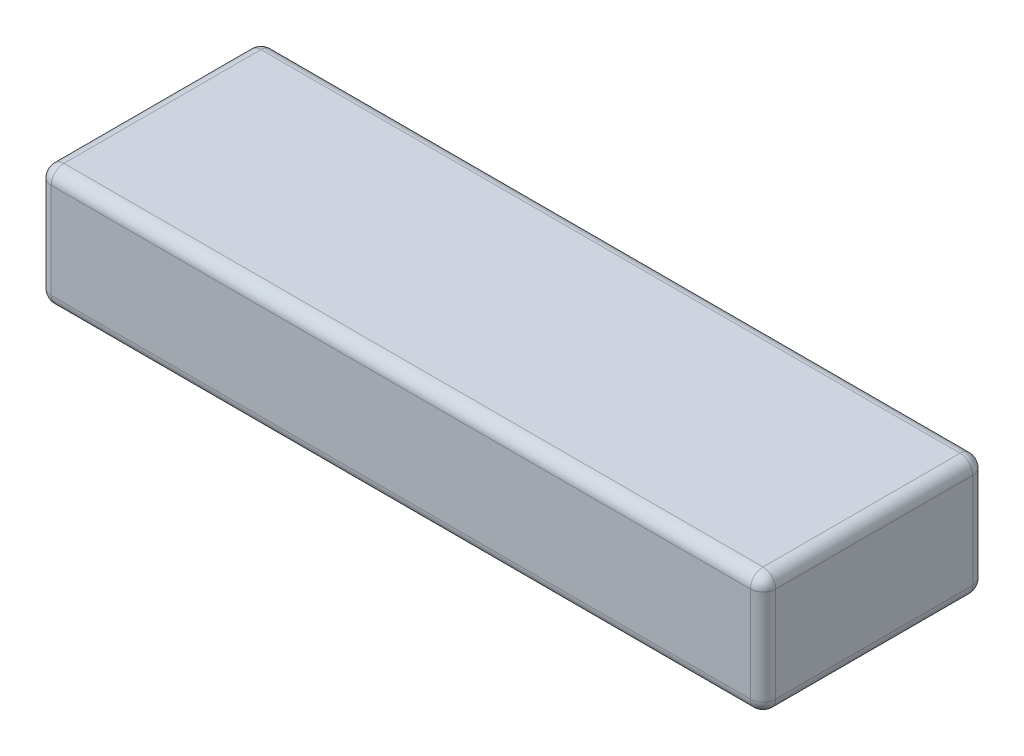
ISO-10303-21;
HEADER;
FILE_DESCRIPTION(('STEP AP214'),'2;1');
FILE_NAME('part.step','',(''),(''),'','','');
FILE_SCHEMA(('AUTOMOTIVE_DESIGN { 1 0 10303 214 1 1 1 1 }'));
ENDSEC;
DATA;
#1=APPLICATION_CONTEXT('core data for automotive mechanical design processes');
#2=APPLICATION_PROTOCOL_DEFINITION('international standard','automotive_design',2000,#1);
#3=PRODUCT_CONTEXT('',#1,'mechanical');
#4=PRODUCT('Part','Part','',(#3));
#5=PRODUCT_RELATED_PRODUCT_CATEGORY('part','',(#4));
#6=PRODUCT_DEFINITION_FORMATION('','',#4);
#7=PRODUCT_DEFINITION_CONTEXT('part definition',#1,'design');
#8=PRODUCT_DEFINITION('design','',#6,#7);
#9=PRODUCT_DEFINITION_SHAPE('','',#8);
#10=(LENGTH_UNIT() NAMED_UNIT(*) SI_UNIT(.MILLI.,.METRE.));
#11=(NAMED_UNIT(*) PLANE_ANGLE_UNIT() SI_UNIT($,.RADIAN.));
#12=(NAMED_UNIT(*) SI_UNIT($,.STERADIAN.) SOLID_ANGLE_UNIT());
#13=UNCERTAINTY_MEASURE_WITH_UNIT(LENGTH_MEASURE(1.E-05),#10,'distance_accuracy_value','');
#14=(GEOMETRIC_REPRESENTATION_CONTEXT(3) GLOBAL_UNCERTAINTY_ASSIGNED_CONTEXT((#13)) GLOBAL_UNIT_ASSIGNED_CONTEXT((#10,
#11,#12)) REPRESENTATION_CONTEXT('',''));
#15=CARTESIAN_POINT('',(0.,0.,0.));
#16=DIRECTION('',(0.,0.,1.));
#17=DIRECTION('',(1.,0.,0.));
#18=AXIS2_PLACEMENT_3D('',#15,#16,#17);
#19=CARTESIAN_POINT('',(0.,19.,0.));
#20=DIRECTION('',(1.,0.,0.));
#21=DIRECTION('',(0.,0.,-1.));
#22=AXIS2_PLACEMENT_3D('',#19,#20,#21);
#23=PLANE('',#22);
#24=DIRECTION('',(0.,0.,1.));
#25=VECTOR('',#24,1.);
#26=CARTESIAN_POINT('',(0.,2.,0.));
#27=LINE('',#26,#25);
#28=CARTESIAN_POINT('',(0.,2.,-33.));
#29=VERTEX_POINT('',#28);
#30=CARTESIAN_POINT('',(0.,2.,-2.));
#31=VERTEX_POINT('',#30);
#32=EDGE_CURVE('E241',#29,#31,#27,.T.);
#33=ORIENTED_EDGE('',*,*,#32,.T.);
#34=DIRECTION('',(0.,-1.,0.));
#35=VECTOR('',#34,1.);
#36=CARTESIAN_POINT('',(0.,19.,-2.));
#37=LINE('',#36,#35);
#38=CARTESIAN_POINT('',(0.,17.,-2.));
#39=VERTEX_POINT('',#38);
#40=EDGE_CURVE('E192',#31,#39,#37,.F.);
#41=ORIENTED_EDGE('',*,*,#40,.T.);
#42=DIRECTION('',(0.,0.,1.));
#43=VECTOR('',#42,1.);
#44=CARTESIAN_POINT('',(0.,17.,0.));
#45=LINE('',#44,#43);
#46=CARTESIAN_POINT('',(0.,17.,-33.));
#47=VERTEX_POINT('',#46);
#48=EDGE_CURVE('E238',#39,#47,#45,.F.);
#49=ORIENTED_EDGE('',*,*,#48,.T.);
#50=DIRECTION('',(0.,-1.,0.));
#51=VECTOR('',#50,1.);
#52=CARTESIAN_POINT('',(0.,19.,-33.));
#53=LINE('',#52,#51);
#54=EDGE_CURVE('E190',#47,#29,#53,.T.);
#55=ORIENTED_EDGE('',*,*,#54,.T.);
#56=EDGE_LOOP('',(#33,#41,#49,#55));
#57=FACE_BOUND('',#56,.T.);
#58=ADVANCED_FACE('F37',(#57),#23,.F.);
#59=CARTESIAN_POINT('',(0.,19.,0.));
#60=DIRECTION('',(0.,0.,-1.));
#61=DIRECTION('',(-1.,0.,0.));
#62=AXIS2_PLACEMENT_3D('',#59,#60,#61);
#63=PLANE('',#62);
#64=DIRECTION('',(1.,0.,0.));
#65=VECTOR('',#64,1.);
#66=CARTESIAN_POINT('',(0.,17.,0.));
#67=LINE('',#66,#65);
#68=CARTESIAN_POINT('',(112.,17.,0.));
#69=VERTEX_POINT('',#68);
#70=CARTESIAN_POINT('',(2.,17.,0.));
#71=VERTEX_POINT('',#70);
#72=EDGE_CURVE('E204',#69,#71,#67,.F.);
#73=ORIENTED_EDGE('',*,*,#72,.T.);
#74=DIRECTION('',(0.,-1.,0.));
#75=VECTOR('',#74,1.);
#76=CARTESIAN_POINT('',(2.,19.,0.));
#77=LINE('',#76,#75);
#78=CARTESIAN_POINT('',(2.,2.,0.));
#79=VERTEX_POINT('',#78);
#80=EDGE_CURVE('E188',#71,#79,#77,.T.);
#81=ORIENTED_EDGE('',*,*,#80,.T.);
#82=DIRECTION('',(1.,0.,0.));
#83=VECTOR('',#82,1.);
#84=CARTESIAN_POINT('',(114.,2.,0.));
#85=LINE('',#84,#83);
#86=CARTESIAN_POINT('',(112.,2.,0.));
#87=VERTEX_POINT('',#86);
#88=EDGE_CURVE('E136',#79,#87,#85,.T.);
#89=ORIENTED_EDGE('',*,*,#88,.T.);
#90=DIRECTION('',(0.,-1.,0.));
#91=VECTOR('',#90,1.);
#92=CARTESIAN_POINT('',(112.,19.,0.));
#93=LINE('',#92,#91);
#94=EDGE_CURVE('E186',#87,#69,#93,.F.);
#95=ORIENTED_EDGE('',*,*,#94,.T.);
#96=EDGE_LOOP('',(#73,#81,#89,#95));
#97=FACE_BOUND('',#96,.T.);
#98=ADVANCED_FACE('F266',(#97),#63,.F.);
#99=CARTESIAN_POINT('',(114.,19.,0.));
#100=DIRECTION('',(-1.,0.,0.));
#101=DIRECTION('',(0.,0.,1.));
#102=AXIS2_PLACEMENT_3D('',#99,#100,#101);
#103=PLANE('',#102);
#104=DIRECTION('',(0.,0.,-1.));
#105=VECTOR('',#104,1.);
#106=CARTESIAN_POINT('',(114.,2.,-35.));
#107=LINE('',#106,#105);
#108=CARTESIAN_POINT('',(114.,2.,-2.));
#109=VERTEX_POINT('',#108);
#110=CARTESIAN_POINT('',(114.,2.,-33.));
#111=VERTEX_POINT('',#110);
#112=EDGE_CURVE('E227',#109,#111,#107,.T.);
#113=ORIENTED_EDGE('',*,*,#112,.T.);
#114=DIRECTION('',(0.,-1.,0.));
#115=VECTOR('',#114,1.);
#116=CARTESIAN_POINT('',(114.,19.,-33.));
#117=LINE('',#116,#115);
#118=CARTESIAN_POINT('',(114.,17.,-33.));
#119=VERTEX_POINT('',#118);
#120=EDGE_CURVE('E11',#111,#119,#117,.F.);
#121=ORIENTED_EDGE('',*,*,#120,.T.);
#122=DIRECTION('',(0.,0.,-1.));
#123=VECTOR('',#122,1.);
#124=CARTESIAN_POINT('',(114.,17.,0.));
#125=LINE('',#124,#123);
#126=CARTESIAN_POINT('',(114.,17.,-2.));
#127=VERTEX_POINT('',#126);
#128=EDGE_CURVE('E160',#119,#127,#125,.F.);
#129=ORIENTED_EDGE('',*,*,#128,.T.);
#130=DIRECTION('',(0.,-1.,0.));
#131=VECTOR('',#130,1.);
#132=CARTESIAN_POINT('',(114.,19.,-2.));
#133=LINE('',#132,#131);
#134=EDGE_CURVE('E46',#127,#109,#133,.T.);
#135=ORIENTED_EDGE('',*,*,#134,.T.);
#136=EDGE_LOOP('',(#113,#121,#129,#135));
#137=FACE_BOUND('',#136,.T.);
#138=ADVANCED_FACE('F306',(#137),#103,.F.);
#139=CARTESIAN_POINT('',(0.,19.,-35.));
#140=DIRECTION('',(0.,0.,1.));
#141=DIRECTION('',(1.,0.,0.));
#142=AXIS2_PLACEMENT_3D('',#139,#140,#141);
#143=PLANE('',#142);
#144=DIRECTION('',(-1.,0.,0.));
#145=VECTOR('',#144,1.);
#146=CARTESIAN_POINT('',(0.,2.,-35.));
#147=LINE('',#146,#145);
#148=CARTESIAN_POINT('',(112.,2.,-35.));
#149=VERTEX_POINT('',#148);
#150=CARTESIAN_POINT('',(2.,2.,-35.));
#151=VERTEX_POINT('',#150);
#152=EDGE_CURVE('E232',#149,#151,#147,.T.);
#153=ORIENTED_EDGE('',*,*,#152,.T.);
#154=DIRECTION('',(0.,-1.,0.));
#155=VECTOR('',#154,1.);
#156=CARTESIAN_POINT('',(2.,19.,-35.));
#157=LINE('',#156,#155);
#158=CARTESIAN_POINT('',(2.,17.,-35.));
#159=VERTEX_POINT('',#158);
#160=EDGE_CURVE('E196',#151,#159,#157,.F.);
#161=ORIENTED_EDGE('',*,*,#160,.T.);
#162=DIRECTION('',(-1.,0.,0.));
#163=VECTOR('',#162,1.);
#164=CARTESIAN_POINT('',(0.,17.,-35.));
#165=LINE('',#164,#163);
#166=CARTESIAN_POINT('',(112.,17.,-35.));
#167=VERTEX_POINT('',#166);
#168=EDGE_CURVE('E229',#159,#167,#165,.F.);
#169=ORIENTED_EDGE('',*,*,#168,.T.);
#170=DIRECTION('',(0.,-1.,0.));
#171=VECTOR('',#170,1.);
#172=CARTESIAN_POINT('',(112.,19.,-35.));
#173=LINE('',#172,#171);
#174=EDGE_CURVE('E194',#167,#149,#173,.T.);
#175=ORIENTED_EDGE('',*,*,#174,.T.);
#176=EDGE_LOOP('',(#153,#161,#169,#175));
#177=FACE_BOUND('',#176,.T.);
#178=ADVANCED_FACE('F289',(#177),#143,.F.);
#179=CARTESIAN_POINT('',(0.,19.,0.));
#180=DIRECTION('',(0.,-1.,0.));
#181=DIRECTION('',(0.,0.,-1.));
#182=AXIS2_PLACEMENT_3D('',#179,#180,#181);
#183=PLANE('',#182);
#184=DIRECTION('',(0.,0.,-1.));
#185=VECTOR('',#184,1.);
#186=CARTESIAN_POINT('',(112.,19.,0.));
#187=LINE('',#186,#185);
#188=CARTESIAN_POINT('',(112.,19.,-2.));
#189=VERTEX_POINT('',#188);
#190=CARTESIAN_POINT('',(112.,19.,-33.));
#191=VERTEX_POINT('',#190);
#192=EDGE_CURVE('E249',#189,#191,#187,.T.);
#193=ORIENTED_EDGE('',*,*,#192,.T.);
#194=DIRECTION('',(-1.,0.,0.));
#195=VECTOR('',#194,1.);
#196=CARTESIAN_POINT('',(0.,19.,-33.));
#197=LINE('',#196,#195);
#198=CARTESIAN_POINT('',(2.,19.,-33.));
#199=VERTEX_POINT('',#198);
#200=EDGE_CURVE('E252',#191,#199,#197,.T.);
#201=ORIENTED_EDGE('',*,*,#200,.T.);
#202=DIRECTION('',(0.,0.,1.));
#203=VECTOR('',#202,1.);
#204=CARTESIAN_POINT('',(2.,19.,0.));
#205=LINE('',#204,#203);
#206=CARTESIAN_POINT('',(2.,19.,-2.));
#207=VERTEX_POINT('',#206);
#208=EDGE_CURVE('E243',#199,#207,#205,.T.);
#209=ORIENTED_EDGE('',*,*,#208,.T.);
#210=DIRECTION('',(1.,0.,0.));
#211=VECTOR('',#210,1.);
#212=CARTESIAN_POINT('',(0.,19.,-2.));
#213=LINE('',#212,#211);
#214=EDGE_CURVE('E246',#207,#189,#213,.T.);
#215=ORIENTED_EDGE('',*,*,#214,.T.);
#216=EDGE_LOOP('',(#193,#201,#209,#215));
#217=FACE_BOUND('',#216,.T.);
#218=ADVANCED_FACE('F315',(#217),#183,.F.);
#219=CARTESIAN_POINT('',(0.,0.,0.));
#220=DIRECTION('',(0.,-1.,0.));
#221=DIRECTION('',(0.,0.,-1.));
#222=AXIS2_PLACEMENT_3D('',#219,#220,#221);
#223=PLANE('',#222);
#224=DIRECTION('',(0.,0.,-1.));
#225=VECTOR('',#224,1.);
#226=CARTESIAN_POINT('',(112.,0.,0.));
#227=LINE('',#226,#225);
#228=CARTESIAN_POINT('',(112.,0.,-33.));
#229=VERTEX_POINT('',#228);
#230=CARTESIAN_POINT('',(112.,0.,-2.));
#231=VERTEX_POINT('',#230);
#232=EDGE_CURVE('E159',#229,#231,#227,.F.);
#233=ORIENTED_EDGE('',*,*,#232,.T.);
#234=DIRECTION('',(1.,0.,0.));
#235=VECTOR('',#234,1.);
#236=CARTESIAN_POINT('',(0.,0.,-2.));
#237=LINE('',#236,#235);
#238=CARTESIAN_POINT('',(2.,0.,-2.));
#239=VERTEX_POINT('',#238);
#240=EDGE_CURVE('E133',#231,#239,#237,.F.);
#241=ORIENTED_EDGE('',*,*,#240,.T.);
#242=DIRECTION('',(0.,0.,1.));
#243=VECTOR('',#242,1.);
#244=CARTESIAN_POINT('',(2.,0.,-35.));
#245=LINE('',#244,#243);
#246=CARTESIAN_POINT('',(2.,0.,-33.));
#247=VERTEX_POINT('',#246);
#248=EDGE_CURVE('E146',#239,#247,#245,.F.);
#249=ORIENTED_EDGE('',*,*,#248,.T.);
#250=DIRECTION('',(-1.,0.,0.));
#251=VECTOR('',#250,1.);
#252=CARTESIAN_POINT('',(114.,0.,-33.));
#253=LINE('',#252,#251);
#254=EDGE_CURVE('E155',#247,#229,#253,.F.);
#255=ORIENTED_EDGE('',*,*,#254,.T.);
#256=EDGE_LOOP('',(#233,#241,#249,#255));
#257=FACE_BOUND('',#256,.T.);
#258=ADVANCED_FACE('F158',(#257),#223,.T.);
#259=CARTESIAN_POINT('',(0.,2.,-33.));
#260=DIRECTION('',(1.,0.,0.));
#261=DIRECTION('',(0.,0.,-1.));
#262=AXIS2_PLACEMENT_3D('',#259,#260,#261);
#263=CYLINDRICAL_SURFACE('',#262,2.);
#264=ORIENTED_EDGE('',*,*,#254,.F.);
#265=CARTESIAN_POINT('',(2.,2.,-33.));
#266=DIRECTION('',(1.,0.,0.));
#267=DIRECTION('',(0.,0.,-1.));
#268=AXIS2_PLACEMENT_3D('',#265,#266,#267);
#269=CIRCLE('',#268,2.);
#270=EDGE_CURVE('E176',#247,#151,#269,.T.);
#271=ORIENTED_EDGE('',*,*,#270,.T.);
#272=ORIENTED_EDGE('',*,*,#152,.F.);
#273=CARTESIAN_POINT('',(112.,2.,-33.));
#274=DIRECTION('',(1.,0.,0.));
#275=DIRECTION('',(0.,0.,-1.));
#276=AXIS2_PLACEMENT_3D('',#273,#274,#275);
#277=CIRCLE('',#276,2.);
#278=EDGE_CURVE('E174',#149,#229,#277,.F.);
#279=ORIENTED_EDGE('',*,*,#278,.T.);
#280=EDGE_LOOP('',(#264,#271,#272,#279));
#281=FACE_BOUND('',#280,.T.);
#282=ADVANCED_FACE('F275',(#281),#263,.T.);
#283=CARTESIAN_POINT('',(2.,2.,0.));
#284=DIRECTION('',(0.,0.,-1.));
#285=DIRECTION('',(-1.,0.,0.));
#286=AXIS2_PLACEMENT_3D('',#283,#284,#285);
#287=CYLINDRICAL_SURFACE('',#286,2.);
#288=ORIENTED_EDGE('',*,*,#248,.F.);
#289=CARTESIAN_POINT('',(2.,2.,-2.));
#290=DIRECTION('',(0.,0.,-1.));
#291=DIRECTION('',(-1.,0.,0.));
#292=AXIS2_PLACEMENT_3D('',#289,#290,#291);
#293=CIRCLE('',#292,2.);
#294=EDGE_CURVE('E149',#239,#31,#293,.T.);
#295=ORIENTED_EDGE('',*,*,#294,.T.);
#296=ORIENTED_EDGE('',*,*,#32,.F.);
#297=CARTESIAN_POINT('',(2.,2.,-33.));
#298=DIRECTION('',(0.,0.,-1.));
#299=DIRECTION('',(-1.,0.,0.));
#300=AXIS2_PLACEMENT_3D('',#297,#298,#299);
#301=CIRCLE('',#300,2.);
#302=EDGE_CURVE('E141',#29,#247,#301,.F.);
#303=ORIENTED_EDGE('',*,*,#302,.T.);
#304=EDGE_LOOP('',(#288,#295,#296,#303));
#305=FACE_BOUND('',#304,.T.);
#306=ADVANCED_FACE('F147',(#305),#287,.T.);
#307=CARTESIAN_POINT('',(112.,2.,0.));
#308=DIRECTION('',(0.,0.,1.));
#309=DIRECTION('',(1.,0.,0.));
#310=AXIS2_PLACEMENT_3D('',#307,#308,#309);
#311=CYLINDRICAL_SURFACE('',#310,2.);
#312=ORIENTED_EDGE('',*,*,#232,.F.);
#313=CARTESIAN_POINT('',(112.,2.,-33.));
#314=DIRECTION('',(0.,0.,1.));
#315=DIRECTION('',(1.,0.,0.));
#316=AXIS2_PLACEMENT_3D('',#313,#314,#315);
#317=CIRCLE('',#316,2.);
#318=EDGE_CURVE('E54',#229,#111,#317,.T.);
#319=ORIENTED_EDGE('',*,*,#318,.T.);
#320=ORIENTED_EDGE('',*,*,#112,.F.);
#321=CARTESIAN_POINT('',(112.,2.,-2.));
#322=DIRECTION('',(0.,0.,1.));
#323=DIRECTION('',(1.,0.,0.));
#324=AXIS2_PLACEMENT_3D('',#321,#322,#323);
#325=CIRCLE('',#324,2.);
#326=EDGE_CURVE('E183',#109,#231,#325,.F.);
#327=ORIENTED_EDGE('',*,*,#326,.T.);
#328=EDGE_LOOP('',(#312,#319,#320,#327));
#329=FACE_BOUND('',#328,.T.);
#330=ADVANCED_FACE('F226',(#329),#311,.T.);
#331=CARTESIAN_POINT('',(0.,2.,-2.));
#332=DIRECTION('',(-1.,0.,0.));
#333=DIRECTION('',(0.,0.,1.));
#334=AXIS2_PLACEMENT_3D('',#331,#332,#333);
#335=CYLINDRICAL_SURFACE('',#334,2.);
#336=ORIENTED_EDGE('',*,*,#88,.F.);
#337=CARTESIAN_POINT('',(2.,2.,-2.));
#338=DIRECTION('',(-1.,0.,0.));
#339=DIRECTION('',(0.,0.,1.));
#340=AXIS2_PLACEMENT_3D('',#337,#338,#339);
#341=CIRCLE('',#340,2.);
#342=EDGE_CURVE('E129',#79,#239,#341,.F.);
#343=ORIENTED_EDGE('',*,*,#342,.T.);
#344=ORIENTED_EDGE('',*,*,#240,.F.);
#345=CARTESIAN_POINT('',(112.,2.,-2.));
#346=DIRECTION('',(-1.,0.,0.));
#347=DIRECTION('',(0.,0.,1.));
#348=AXIS2_PLACEMENT_3D('',#345,#346,#347);
#349=CIRCLE('',#348,2.);
#350=EDGE_CURVE('E142',#231,#87,#349,.T.);
#351=ORIENTED_EDGE('',*,*,#350,.T.);
#352=EDGE_LOOP('',(#336,#343,#344,#351));
#353=FACE_BOUND('',#352,.T.);
#354=ADVANCED_FACE('F131',(#353),#335,.T.);
#355=CARTESIAN_POINT('',(0.,17.,-2.));
#356=DIRECTION('',(1.,0.,0.));
#357=DIRECTION('',(0.,0.,-1.));
#358=AXIS2_PLACEMENT_3D('',#355,#356,#357);
#359=CYLINDRICAL_SURFACE('',#358,2.);
#360=ORIENTED_EDGE('',*,*,#214,.F.);
#361=CARTESIAN_POINT('',(2.,17.,-2.));
#362=DIRECTION('',(1.,0.,0.));
#363=DIRECTION('',(0.,0.,-1.));
#364=AXIS2_PLACEMENT_3D('',#361,#362,#363);
#365=CIRCLE('',#364,2.);
#366=EDGE_CURVE('E262',#207,#71,#365,.T.);
#367=ORIENTED_EDGE('',*,*,#366,.T.);
#368=ORIENTED_EDGE('',*,*,#72,.F.);
#369=CARTESIAN_POINT('',(112.,17.,-2.));
#370=DIRECTION('',(1.,0.,0.));
#371=DIRECTION('',(0.,0.,-1.));
#372=AXIS2_PLACEMENT_3D('',#369,#370,#371);
#373=CIRCLE('',#372,2.);
#374=EDGE_CURVE('E260',#69,#189,#373,.F.);
#375=ORIENTED_EDGE('',*,*,#374,.T.);
#376=EDGE_LOOP('',(#360,#367,#368,#375));
#377=FACE_BOUND('',#376,.T.);
#378=ADVANCED_FACE('F313',(#377),#359,.T.);
#379=CARTESIAN_POINT('',(112.,17.,0.));
#380=DIRECTION('',(0.,0.,-1.));
#381=DIRECTION('',(-1.,0.,0.));
#382=AXIS2_PLACEMENT_3D('',#379,#380,#381);
#383=CYLINDRICAL_SURFACE('',#382,2.);
#384=ORIENTED_EDGE('',*,*,#128,.F.);
#385=CARTESIAN_POINT('',(112.,17.,-33.));
#386=DIRECTION('',(0.,0.,-1.));
#387=DIRECTION('',(-1.,0.,0.));
#388=AXIS2_PLACEMENT_3D('',#385,#386,#387);
#389=CIRCLE('',#388,2.);
#390=EDGE_CURVE('E181',#119,#191,#389,.F.);
#391=ORIENTED_EDGE('',*,*,#390,.T.);
#392=ORIENTED_EDGE('',*,*,#192,.F.);
#393=CARTESIAN_POINT('',(112.,17.,-2.));
#394=DIRECTION('',(0.,0.,-1.));
#395=DIRECTION('',(-1.,0.,0.));
#396=AXIS2_PLACEMENT_3D('',#393,#394,#395);
#397=CIRCLE('',#396,2.);
#398=EDGE_CURVE('E178',#189,#127,#397,.T.);
#399=ORIENTED_EDGE('',*,*,#398,.T.);
#400=EDGE_LOOP('',(#384,#391,#392,#399));
#401=FACE_BOUND('',#400,.T.);
#402=ADVANCED_FACE('F308',(#401),#383,.T.);
#403=CARTESIAN_POINT('',(2.,17.,0.));
#404=DIRECTION('',(0.,0.,1.));
#405=DIRECTION('',(1.,0.,0.));
#406=AXIS2_PLACEMENT_3D('',#403,#404,#405);
#407=CYLINDRICAL_SURFACE('',#406,2.);
#408=ORIENTED_EDGE('',*,*,#48,.F.);
#409=CARTESIAN_POINT('',(2.,17.,-2.));
#410=DIRECTION('',(0.,0.,1.));
#411=DIRECTION('',(1.,0.,0.));
#412=AXIS2_PLACEMENT_3D('',#409,#410,#411);
#413=CIRCLE('',#412,2.);
#414=EDGE_CURVE('E257',#39,#207,#413,.F.);
#415=ORIENTED_EDGE('',*,*,#414,.T.);
#416=ORIENTED_EDGE('',*,*,#208,.F.);
#417=CARTESIAN_POINT('',(2.,17.,-33.));
#418=DIRECTION('',(0.,0.,1.));
#419=DIRECTION('',(1.,0.,0.));
#420=AXIS2_PLACEMENT_3D('',#417,#418,#419);
#421=CIRCLE('',#420,2.);
#422=EDGE_CURVE('E255',#199,#47,#421,.T.);
#423=ORIENTED_EDGE('',*,*,#422,.T.);
#424=EDGE_LOOP('',(#408,#415,#416,#423));
#425=FACE_BOUND('',#424,.T.);
#426=ADVANCED_FACE('F318',(#425),#407,.T.);
#427=CARTESIAN_POINT('',(0.,17.,-33.));
#428=DIRECTION('',(-1.,0.,0.));
#429=DIRECTION('',(0.,0.,1.));
#430=AXIS2_PLACEMENT_3D('',#427,#428,#429);
#431=CYLINDRICAL_SURFACE('',#430,2.);
#432=ORIENTED_EDGE('',*,*,#168,.F.);
#433=CARTESIAN_POINT('',(2.,17.,-33.));
#434=DIRECTION('',(-1.,0.,0.));
#435=DIRECTION('',(0.,0.,1.));
#436=AXIS2_PLACEMENT_3D('',#433,#434,#435);
#437=CIRCLE('',#436,2.);
#438=EDGE_CURVE('E168',#159,#199,#437,.F.);
#439=ORIENTED_EDGE('',*,*,#438,.T.);
#440=ORIENTED_EDGE('',*,*,#200,.F.);
#441=CARTESIAN_POINT('',(112.,17.,-33.));
#442=DIRECTION('',(-1.,0.,0.));
#443=DIRECTION('',(0.,0.,1.));
#444=AXIS2_PLACEMENT_3D('',#441,#442,#443);
#445=CIRCLE('',#444,2.);
#446=EDGE_CURVE('E165',#191,#167,#445,.T.);
#447=ORIENTED_EDGE('',*,*,#446,.T.);
#448=EDGE_LOOP('',(#432,#439,#440,#447));
#449=FACE_BOUND('',#448,.T.);
#450=ADVANCED_FACE('F291',(#449),#431,.T.);
#451=CARTESIAN_POINT('',(2.,2.,-2.));
#452=DIRECTION('',(0.,0.,1.));
#453=DIRECTION('',(1.,0.,0.));
#454=AXIS2_PLACEMENT_3D('',#451,#452,#453);
#455=SPHERICAL_SURFACE('',#454,2.);
#456=ORIENTED_EDGE('',*,*,#294,.F.);
#457=ORIENTED_EDGE('',*,*,#342,.F.);
#458=CARTESIAN_POINT('',(2.,2.,-2.));
#459=DIRECTION('',(0.,1.,0.));
#460=DIRECTION('',(0.,0.,1.));
#461=AXIS2_PLACEMENT_3D('',#458,#459,#460);
#462=CIRCLE('',#461,2.);
#463=EDGE_CURVE('E163',#31,#79,#462,.T.);
#464=ORIENTED_EDGE('',*,*,#463,.F.);
#465=EDGE_LOOP('',(#456,#457,#464));
#466=FACE_BOUND('',#465,.T.);
#467=ADVANCED_FACE('F162',(#466),#455,.T.);
#468=CARTESIAN_POINT('',(2.,19.,-2.));
#469=DIRECTION('',(0.,-1.,0.));
#470=DIRECTION('',(0.,0.,-1.));
#471=AXIS2_PLACEMENT_3D('',#468,#469,#470);
#472=CYLINDRICAL_SURFACE('',#471,2.);
#473=ORIENTED_EDGE('',*,*,#463,.T.);
#474=ORIENTED_EDGE('',*,*,#80,.F.);
#475=CARTESIAN_POINT('',(2.,17.,-2.));
#476=DIRECTION('',(0.,1.,0.));
#477=DIRECTION('',(0.,0.,1.));
#478=AXIS2_PLACEMENT_3D('',#475,#476,#477);
#479=CIRCLE('',#478,2.);
#480=EDGE_CURVE('E199',#39,#71,#479,.T.);
#481=ORIENTED_EDGE('',*,*,#480,.F.);
#482=ORIENTED_EDGE('',*,*,#40,.F.);
#483=EDGE_LOOP('',(#473,#474,#481,#482));
#484=FACE_BOUND('',#483,.T.);
#485=ADVANCED_FACE('F324',(#484),#472,.T.);
#486=CARTESIAN_POINT('',(2.,17.,-2.));
#487=DIRECTION('',(0.,0.,1.));
#488=DIRECTION('',(1.,0.,0.));
#489=AXIS2_PLACEMENT_3D('',#486,#487,#488);
#490=SPHERICAL_SURFACE('',#489,2.);
#491=ORIENTED_EDGE('',*,*,#480,.T.);
#492=ORIENTED_EDGE('',*,*,#366,.F.);
#493=ORIENTED_EDGE('',*,*,#414,.F.);
#494=EDGE_LOOP('',(#491,#492,#493));
#495=FACE_BOUND('',#494,.T.);
#496=ADVANCED_FACE('F322',(#495),#490,.T.);
#497=CARTESIAN_POINT('',(2.,2.,-33.));
#498=DIRECTION('',(0.,0.,1.));
#499=DIRECTION('',(1.,0.,0.));
#500=AXIS2_PLACEMENT_3D('',#497,#498,#499);
#501=SPHERICAL_SURFACE('',#500,2.);
#502=ORIENTED_EDGE('',*,*,#270,.F.);
#503=ORIENTED_EDGE('',*,*,#302,.F.);
#504=CARTESIAN_POINT('',(2.,2.,-33.));
#505=DIRECTION('',(0.,1.,0.));
#506=DIRECTION('',(0.,0.,1.));
#507=AXIS2_PLACEMENT_3D('',#504,#505,#506);
#508=CIRCLE('',#507,2.);
#509=EDGE_CURVE('E202',#151,#29,#508,.T.);
#510=ORIENTED_EDGE('',*,*,#509,.F.);
#511=EDGE_LOOP('',(#502,#503,#510));
#512=FACE_BOUND('',#511,.T.);
#513=ADVANCED_FACE('F280',(#512),#501,.T.);
#514=CARTESIAN_POINT('',(2.,19.,-33.));
#515=DIRECTION('',(0.,-1.,0.));
#516=DIRECTION('',(0.,0.,-1.));
#517=AXIS2_PLACEMENT_3D('',#514,#515,#516);
#518=CYLINDRICAL_SURFACE('',#517,2.);
#519=ORIENTED_EDGE('',*,*,#509,.T.);
#520=ORIENTED_EDGE('',*,*,#54,.F.);
#521=CARTESIAN_POINT('',(2.,17.,-33.));
#522=DIRECTION('',(0.,1.,0.));
#523=DIRECTION('',(0.,0.,1.));
#524=AXIS2_PLACEMENT_3D('',#521,#522,#523);
#525=CIRCLE('',#524,2.);
#526=EDGE_CURVE('E205',#159,#47,#525,.T.);
#527=ORIENTED_EDGE('',*,*,#526,.F.);
#528=ORIENTED_EDGE('',*,*,#160,.F.);
#529=EDGE_LOOP('',(#519,#520,#527,#528));
#530=FACE_BOUND('',#529,.T.);
#531=ADVANCED_FACE('F285',(#530),#518,.T.);
#532=CARTESIAN_POINT('',(2.,17.,-33.));
#533=DIRECTION('',(0.,0.,1.));
#534=DIRECTION('',(1.,0.,0.));
#535=AXIS2_PLACEMENT_3D('',#532,#533,#534);
#536=SPHERICAL_SURFACE('',#535,2.);
#537=ORIENTED_EDGE('',*,*,#526,.T.);
#538=ORIENTED_EDGE('',*,*,#422,.F.);
#539=ORIENTED_EDGE('',*,*,#438,.F.);
#540=EDGE_LOOP('',(#537,#538,#539));
#541=FACE_BOUND('',#540,.T.);
#542=ADVANCED_FACE('F327',(#541),#536,.T.);
#543=CARTESIAN_POINT('',(112.,2.,-33.));
#544=DIRECTION('',(0.,0.,1.));
#545=DIRECTION('',(1.,0.,0.));
#546=AXIS2_PLACEMENT_3D('',#543,#544,#545);
#547=SPHERICAL_SURFACE('',#546,2.);
#548=ORIENTED_EDGE('',*,*,#318,.F.);
#549=ORIENTED_EDGE('',*,*,#278,.F.);
#550=CARTESIAN_POINT('',(112.,2.,-33.));
#551=DIRECTION('',(0.,1.,0.));
#552=DIRECTION('',(0.,0.,1.));
#553=AXIS2_PLACEMENT_3D('',#550,#551,#552);
#554=CIRCLE('',#553,2.);
#555=EDGE_CURVE('E208',#111,#149,#554,.T.);
#556=ORIENTED_EDGE('',*,*,#555,.F.);
#557=EDGE_LOOP('',(#548,#549,#556));
#558=FACE_BOUND('',#557,.T.);
#559=ADVANCED_FACE('F304',(#558),#547,.T.);
#560=CARTESIAN_POINT('',(112.,19.,-33.));
#561=DIRECTION('',(0.,-1.,0.));
#562=DIRECTION('',(0.,0.,-1.));
#563=AXIS2_PLACEMENT_3D('',#560,#561,#562);
#564=CYLINDRICAL_SURFACE('',#563,2.);
#565=ORIENTED_EDGE('',*,*,#555,.T.);
#566=ORIENTED_EDGE('',*,*,#174,.F.);
#567=CARTESIAN_POINT('',(112.,17.,-33.));
#568=DIRECTION('',(0.,1.,0.));
#569=DIRECTION('',(0.,0.,1.));
#570=AXIS2_PLACEMENT_3D('',#567,#568,#569);
#571=CIRCLE('',#570,2.);
#572=EDGE_CURVE('E211',#119,#167,#571,.T.);
#573=ORIENTED_EDGE('',*,*,#572,.F.);
#574=ORIENTED_EDGE('',*,*,#120,.F.);
#575=EDGE_LOOP('',(#565,#566,#573,#574));
#576=FACE_BOUND('',#575,.T.);
#577=ADVANCED_FACE('F302',(#576),#564,.T.);
#578=CARTESIAN_POINT('',(112.,17.,-33.));
#579=DIRECTION('',(0.,0.,1.));
#580=DIRECTION('',(1.,0.,0.));
#581=AXIS2_PLACEMENT_3D('',#578,#579,#580);
#582=SPHERICAL_SURFACE('',#581,2.);
#583=ORIENTED_EDGE('',*,*,#446,.F.);
#584=ORIENTED_EDGE('',*,*,#390,.F.);
#585=ORIENTED_EDGE('',*,*,#572,.T.);
#586=EDGE_LOOP('',(#583,#584,#585));
#587=FACE_BOUND('',#586,.T.);
#588=ADVANCED_FACE('F297',(#587),#582,.T.);
#589=CARTESIAN_POINT('',(112.,2.,-2.));
#590=DIRECTION('',(0.,0.,1.));
#591=DIRECTION('',(1.,0.,0.));
#592=AXIS2_PLACEMENT_3D('',#589,#590,#591);
#593=SPHERICAL_SURFACE('',#592,2.);
#594=ORIENTED_EDGE('',*,*,#350,.F.);
#595=ORIENTED_EDGE('',*,*,#326,.F.);
#596=CARTESIAN_POINT('',(112.,2.,-2.));
#597=DIRECTION('',(0.,1.,0.));
#598=DIRECTION('',(0.,0.,1.));
#599=AXIS2_PLACEMENT_3D('',#596,#597,#598);
#600=CIRCLE('',#599,2.);
#601=EDGE_CURVE('E41',#87,#109,#600,.T.);
#602=ORIENTED_EDGE('',*,*,#601,.F.);
#603=EDGE_LOOP('',(#594,#595,#602));
#604=FACE_BOUND('',#603,.T.);
#605=ADVANCED_FACE('F39',(#604),#593,.T.);
#606=CARTESIAN_POINT('',(112.,19.,-2.));
#607=DIRECTION('',(0.,-1.,0.));
#608=DIRECTION('',(0.,0.,-1.));
#609=AXIS2_PLACEMENT_3D('',#606,#607,#608);
#610=CYLINDRICAL_SURFACE('',#609,2.);
#611=ORIENTED_EDGE('',*,*,#601,.T.);
#612=ORIENTED_EDGE('',*,*,#134,.F.);
#613=CARTESIAN_POINT('',(112.,17.,-2.));
#614=DIRECTION('',(0.,1.,0.));
#615=DIRECTION('',(0.,0.,1.));
#616=AXIS2_PLACEMENT_3D('',#613,#614,#615);
#617=CIRCLE('',#616,2.);
#618=EDGE_CURVE('E214',#69,#127,#617,.T.);
#619=ORIENTED_EDGE('',*,*,#618,.F.);
#620=ORIENTED_EDGE('',*,*,#94,.F.);
#621=EDGE_LOOP('',(#611,#612,#619,#620));
#622=FACE_BOUND('',#621,.T.);
#623=ADVANCED_FACE('F223',(#622),#610,.T.);
#624=CARTESIAN_POINT('',(112.,17.,-2.));
#625=DIRECTION('',(0.,0.,1.));
#626=DIRECTION('',(1.,0.,0.));
#627=AXIS2_PLACEMENT_3D('',#624,#625,#626);
#628=SPHERICAL_SURFACE('',#627,2.);
#629=ORIENTED_EDGE('',*,*,#398,.F.);
#630=ORIENTED_EDGE('',*,*,#374,.F.);
#631=ORIENTED_EDGE('',*,*,#618,.T.);
#632=EDGE_LOOP('',(#629,#630,#631));
#633=FACE_BOUND('',#632,.T.);
#634=ADVANCED_FACE('F310',(#633),#628,.T.);
#635=CLOSED_SHELL('',(#58,#98,#138,#178,#218,#258,#282,#306,#330,#354,#378,#402,#426,#450,#467,
#485,#496,#513,#531,#542,#559,#577,#588,#605,#623,#634));
#636=MANIFOLD_SOLID_BREP('B2',#635);
#637=ADVANCED_BREP_SHAPE_REPRESENTATION('',(#18,#636),#14);
#638=SHAPE_DEFINITION_REPRESENTATION(#9,#637);
ENDSEC;
END-ISO-10303-21;
